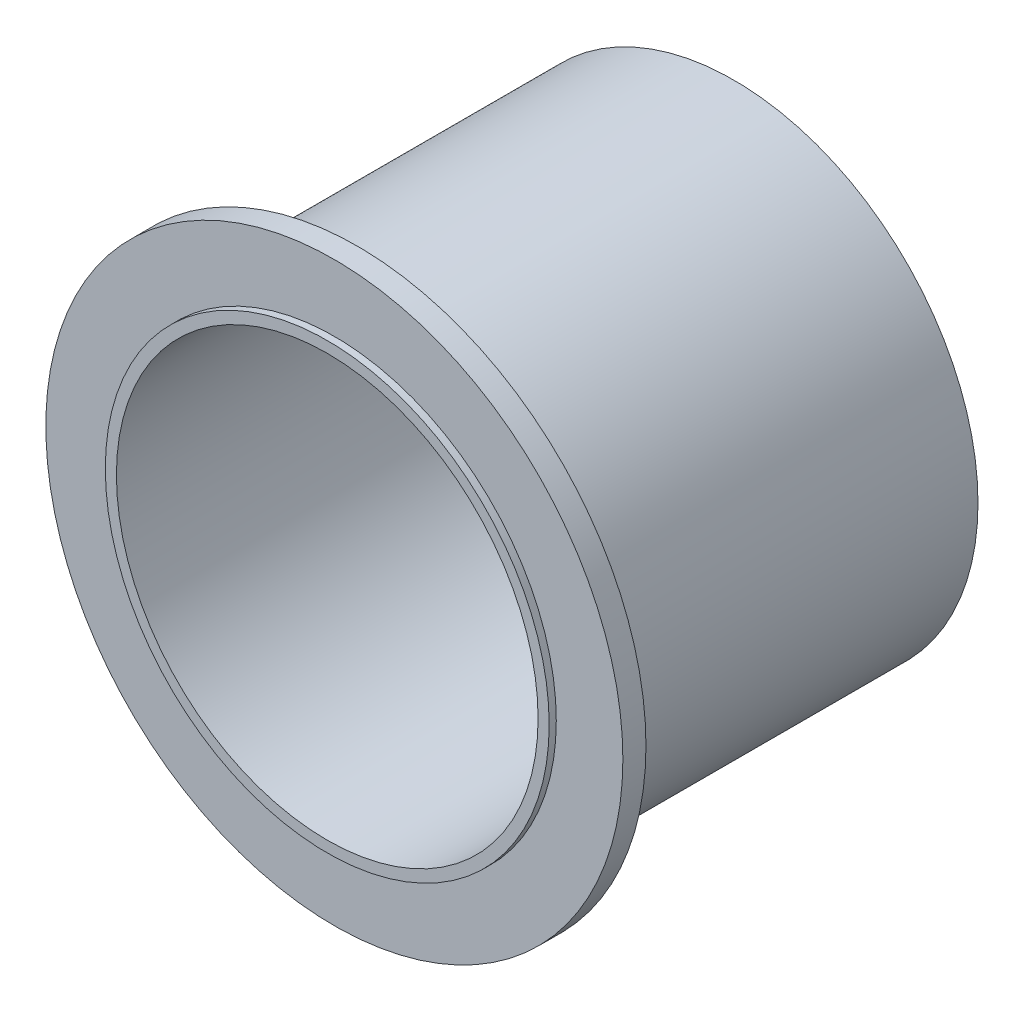
ISO-10303-21;
HEADER;
FILE_DESCRIPTION(('STEP AP214'),'2;1');
FILE_NAME('part.step','',(''),(''),'','','');
FILE_SCHEMA(('AUTOMOTIVE_DESIGN { 1 0 10303 214 1 1 1 1 }'));
ENDSEC;
DATA;
#1=APPLICATION_CONTEXT('core data for automotive mechanical design processes');
#2=APPLICATION_PROTOCOL_DEFINITION('international standard','automotive_design',2000,#1);
#3=PRODUCT_CONTEXT('',#1,'mechanical');
#4=PRODUCT('Part','Part','',(#3));
#5=PRODUCT_RELATED_PRODUCT_CATEGORY('part','',(#4));
#6=PRODUCT_DEFINITION_FORMATION('','',#4);
#7=PRODUCT_DEFINITION_CONTEXT('part definition',#1,'design');
#8=PRODUCT_DEFINITION('design','',#6,#7);
#9=PRODUCT_DEFINITION_SHAPE('','',#8);
#10=(LENGTH_UNIT() NAMED_UNIT(*) SI_UNIT(.MILLI.,.METRE.));
#11=(NAMED_UNIT(*) PLANE_ANGLE_UNIT() SI_UNIT($,.RADIAN.));
#12=(NAMED_UNIT(*) SI_UNIT($,.STERADIAN.) SOLID_ANGLE_UNIT());
#13=UNCERTAINTY_MEASURE_WITH_UNIT(LENGTH_MEASURE(1.E-05),#10,'distance_accuracy_value','');
#14=(GEOMETRIC_REPRESENTATION_CONTEXT(3) GLOBAL_UNCERTAINTY_ASSIGNED_CONTEXT((#13)) GLOBAL_UNIT_ASSIGNED_CONTEXT((#10,
#11,#12)) REPRESENTATION_CONTEXT('',''));
#15=CARTESIAN_POINT('',(0.,0.,0.));
#16=DIRECTION('',(0.,0.,1.));
#17=DIRECTION('',(1.,0.,0.));
#18=AXIS2_PLACEMENT_3D('',#15,#16,#17);
#19=CARTESIAN_POINT('',(0.,0.,0.));
#20=DIRECTION('',(0.,0.,1.));
#21=DIRECTION('',(1.,0.,0.));
#22=AXIS2_PLACEMENT_3D('',#19,#20,#21);
#23=PLANE('',#22);
#24=CARTESIAN_POINT('',(0.,0.,0.));
#25=DIRECTION('',(0.,0.,1.));
#26=DIRECTION('',(1.,0.,0.));
#27=AXIS2_PLACEMENT_3D('',#24,#25,#26);
#28=CIRCLE('',#27,35.9957091385299);
#29=CARTESIAN_POINT('',(35.9957091385299,0.,0.));
#30=VERTEX_POINT('',#29);
#31=EDGE_CURVE('E43',#30,#30,#28,.F.);
#32=ORIENTED_EDGE('',*,*,#31,.T.);
#33=EDGE_LOOP('',(#32));
#34=FACE_BOUND('',#33,.T.);
#35=CARTESIAN_POINT('',(0.,0.,0.));
#36=DIRECTION('',(0.,0.,1.));
#37=DIRECTION('',(1.,0.,0.));
#38=AXIS2_PLACEMENT_3D('',#35,#36,#37);
#39=CIRCLE('',#38,35.687);
#40=CARTESIAN_POINT('',(35.687,0.,0.));
#41=VERTEX_POINT('',#40);
#42=EDGE_CURVE('E52',#41,#41,#39,.T.);
#43=ORIENTED_EDGE('',*,*,#42,.T.);
#44=EDGE_LOOP('',(#43));
#45=FACE_BOUND('',#44,.T.);
#46=ADVANCED_FACE('F32',(#34,#45),#23,.F.);
#47=CARTESIAN_POINT('',(0.,0.,6.35));
#48=DIRECTION('',(0.,0.,1.));
#49=DIRECTION('',(1.,0.,0.));
#50=AXIS2_PLACEMENT_3D('',#47,#48,#49);
#51=PLANE('',#50);
#52=CARTESIAN_POINT('',(0.,0.,6.35));
#53=DIRECTION('',(0.,0.,1.));
#54=DIRECTION('',(1.,0.,0.));
#55=AXIS2_PLACEMENT_3D('',#52,#53,#54);
#56=CIRCLE('',#55,41.275);
#57=CARTESIAN_POINT('',(41.275,0.,6.35));
#58=VERTEX_POINT('',#57);
#59=EDGE_CURVE('E58',#58,#58,#56,.T.);
#60=ORIENTED_EDGE('',*,*,#59,.T.);
#61=EDGE_LOOP('',(#60));
#62=FACE_BOUND('',#61,.T.);
#63=CARTESIAN_POINT('',(0.,0.,6.35));
#64=DIRECTION('',(0.,0.,1.));
#65=DIRECTION('',(1.,0.,0.));
#66=AXIS2_PLACEMENT_3D('',#63,#64,#65);
#67=CIRCLE('',#66,31.75);
#68=CARTESIAN_POINT('',(31.75,0.,6.35));
#69=VERTEX_POINT('',#68);
#70=EDGE_CURVE('E64',#69,#69,#67,.T.);
#71=ORIENTED_EDGE('',*,*,#70,.F.);
#72=EDGE_LOOP('',(#71));
#73=FACE_BOUND('',#72,.T.);
#74=ADVANCED_FACE('F89',(#62,#73),#51,.T.);
#75=CARTESIAN_POINT('',(0.,0.,6.35));
#76=DIRECTION('',(0.,0.,-1.));
#77=DIRECTION('',(-1.,0.,0.));
#78=AXIS2_PLACEMENT_3D('',#75,#76,#77);
#79=CYLINDRICAL_SURFACE('',#78,41.275);
#80=CARTESIAN_POINT('',(0.,0.,3.04800000000004));
#81=DIRECTION('',(0.,0.,1.));
#82=DIRECTION('',(1.,0.,0.));
#83=AXIS2_PLACEMENT_3D('',#80,#81,#82);
#84=CIRCLE('',#83,41.275);
#85=CARTESIAN_POINT('',(41.275,0.,3.04800000000004));
#86=VERTEX_POINT('',#85);
#87=EDGE_CURVE('E47',#86,#86,#84,.T.);
#88=ORIENTED_EDGE('',*,*,#87,.T.);
#89=EDGE_LOOP('',(#88));
#90=FACE_BOUND('',#89,.T.);
#91=ORIENTED_EDGE('',*,*,#59,.F.);
#92=EDGE_LOOP('',(#91));
#93=FACE_BOUND('',#92,.T.);
#94=ADVANCED_FACE('F34',(#90,#93),#79,.T.);
#95=CARTESIAN_POINT('',(0.,0.,7.366));
#96=DIRECTION('',(0.,0.,-1.));
#97=DIRECTION('',(-1.,0.,0.));
#98=AXIS2_PLACEMENT_3D('',#95,#96,#97);
#99=CYLINDRICAL_SURFACE('',#98,31.75);
#100=CARTESIAN_POINT('',(0.,0.,7.366));
#101=DIRECTION('',(0.,0.,1.));
#102=DIRECTION('',(1.,0.,0.));
#103=AXIS2_PLACEMENT_3D('',#100,#101,#102);
#104=CIRCLE('',#103,31.75);
#105=CARTESIAN_POINT('',(31.75,0.,7.366));
#106=VERTEX_POINT('',#105);
#107=EDGE_CURVE('E61',#106,#106,#104,.T.);
#108=ORIENTED_EDGE('',*,*,#107,.F.);
#109=EDGE_LOOP('',(#108));
#110=FACE_BOUND('',#109,.T.);
#111=ORIENTED_EDGE('',*,*,#70,.T.);
#112=EDGE_LOOP('',(#111));
#113=FACE_BOUND('',#112,.T.);
#114=ADVANCED_FACE('F80',(#110,#113),#99,.T.);
#115=CARTESIAN_POINT('',(0.,0.,7.366));
#116=DIRECTION('',(0.,0.,1.));
#117=DIRECTION('',(1.,0.,0.));
#118=AXIS2_PLACEMENT_3D('',#115,#116,#117);
#119=PLANE('',#118);
#120=CARTESIAN_POINT('',(0.,0.,7.366));
#121=DIRECTION('',(0.,0.,1.));
#122=DIRECTION('',(1.,0.,0.));
#123=AXIS2_PLACEMENT_3D('',#120,#121,#122);
#124=CIRCLE('',#123,30.1625);
#125=CARTESIAN_POINT('',(30.1625,0.,7.366));
#126=VERTEX_POINT('',#125);
#127=EDGE_CURVE('E70',#126,#126,#124,.T.);
#128=ORIENTED_EDGE('',*,*,#127,.F.);
#129=EDGE_LOOP('',(#128));
#130=FACE_BOUND('',#129,.T.);
#131=ORIENTED_EDGE('',*,*,#107,.T.);
#132=EDGE_LOOP('',(#131));
#133=FACE_BOUND('',#132,.T.);
#134=ADVANCED_FACE('F76',(#130,#133),#119,.T.);
#135=CARTESIAN_POINT('',(0.,0.,-50.8));
#136=DIRECTION('',(0.,0.,1.));
#137=DIRECTION('',(1.,0.,0.));
#138=AXIS2_PLACEMENT_3D('',#135,#136,#137);
#139=CYLINDRICAL_SURFACE('',#138,34.925);
#140=CARTESIAN_POINT('',(0.,0.,-0.762000000000013));
#141=DIRECTION('',(0.,0.,1.));
#142=DIRECTION('',(1.,0.,0.));
#143=AXIS2_PLACEMENT_3D('',#140,#141,#142);
#144=CIRCLE('',#143,34.925);
#145=CARTESIAN_POINT('',(34.925,0.,-0.762000000000013));
#146=VERTEX_POINT('',#145);
#147=EDGE_CURVE('E55',#146,#146,#144,.F.);
#148=ORIENTED_EDGE('',*,*,#147,.T.);
#149=EDGE_LOOP('',(#148));
#150=FACE_BOUND('',#149,.T.);
#151=CARTESIAN_POINT('',(0.,0.,-50.8));
#152=DIRECTION('',(0.,0.,-1.));
#153=DIRECTION('',(-1.,0.,0.));
#154=AXIS2_PLACEMENT_3D('',#151,#152,#153);
#155=CIRCLE('',#154,34.925);
#156=CARTESIAN_POINT('',(-34.925,0.,-50.8));
#157=VERTEX_POINT('',#156);
#158=EDGE_CURVE('E67',#157,#157,#155,.T.);
#159=ORIENTED_EDGE('',*,*,#158,.F.);
#160=EDGE_LOOP('',(#159));
#161=FACE_BOUND('',#160,.T.);
#162=ADVANCED_FACE('F79',(#150,#161),#139,.T.);
#163=CARTESIAN_POINT('',(0.,0.,-50.8));
#164=DIRECTION('',(0.,0.,-1.));
#165=DIRECTION('',(-1.,0.,0.));
#166=AXIS2_PLACEMENT_3D('',#163,#164,#165);
#167=PLANE('',#166);
#168=CARTESIAN_POINT('',(0.,0.,-50.8));
#169=DIRECTION('',(0.,0.,-1.));
#170=DIRECTION('',(-1.,0.,0.));
#171=AXIS2_PLACEMENT_3D('',#168,#169,#170);
#172=CIRCLE('',#171,33.3375);
#173=CARTESIAN_POINT('',(-33.3375,0.,-50.8));
#174=VERTEX_POINT('',#173);
#175=EDGE_CURVE('E39',#174,#174,#172,.F.);
#176=ORIENTED_EDGE('',*,*,#175,.T.);
#177=EDGE_LOOP('',(#176));
#178=FACE_BOUND('',#177,.T.);
#179=ORIENTED_EDGE('',*,*,#158,.T.);
#180=EDGE_LOOP('',(#179));
#181=FACE_BOUND('',#180,.T.);
#182=ADVANCED_FACE('F102',(#178,#181),#167,.T.);
#183=CARTESIAN_POINT('',(0.,0.,-0.762000000000013));
#184=DIRECTION('',(0.,0.,1.));
#185=DIRECTION('',(1.,0.,0.));
#186=AXIS2_PLACEMENT_3D('',#183,#184,#185);
#187=CONICAL_SURFACE('',#186,34.925,0.785398163397444);
#188=CARTESIAN_POINT('',(35.687,0.,0.));
#189=CARTESIAN_POINT('',(35.6790625,0.,-0.00793750000000187));
#190=CARTESIAN_POINT('',(35.671125,0.,-0.0158750000000015));
#191=CARTESIAN_POINT('',(35.65525,0.,-0.0317500000000007));
#192=CARTESIAN_POINT('',(35.6473125,0.,-0.0396875000000003));
#193=CARTESIAN_POINT('',(35.6314375,0.,-0.0555625000000004));
#194=CARTESIAN_POINT('',(35.6235,0.,-0.0635000000000008));
#195=CARTESIAN_POINT('',(35.607625,0.,-0.0793750000000018));
#196=CARTESIAN_POINT('',(35.5996875,0.,-0.0873125000000023));
#197=CARTESIAN_POINT('',(35.5838125,0.,-0.103187500000002));
#198=CARTESIAN_POINT('',(35.575875,0.,-0.111125000000002));
#199=CARTESIAN_POINT('',(35.56,0.,-0.127000000000001));
#200=CARTESIAN_POINT('',(35.5520625,0.,-0.134937500000002));
#201=CARTESIAN_POINT('',(35.5361875,0.,-0.150812500000003));
#202=CARTESIAN_POINT('',(35.52825,0.,-0.158750000000003));
#203=CARTESIAN_POINT('',(35.512375,0.,-0.174625000000003));
#204=CARTESIAN_POINT('',(35.5044375,0.,-0.182562500000003));
#205=CARTESIAN_POINT('',(35.4885625,0.,-0.198437500000003));
#206=CARTESIAN_POINT('',(35.480625,0.,-0.206375000000003));
#207=CARTESIAN_POINT('',(35.46475,0.,-0.222250000000004));
#208=CARTESIAN_POINT('',(35.4568125,0.,-0.230187500000005));
#209=CARTESIAN_POINT('',(35.4409375,0.,-0.246062500000005));
#210=CARTESIAN_POINT('',(35.433,0.,-0.254000000000004));
#211=CARTESIAN_POINT('',(35.417125,0.,-0.269875000000004));
#212=CARTESIAN_POINT('',(35.4091875,0.,-0.277812500000004));
#213=CARTESIAN_POINT('',(35.3933125,0.,-0.293687500000005));
#214=CARTESIAN_POINT('',(35.385375,0.,-0.301625000000006));
#215=CARTESIAN_POINT('',(35.3695,0.,-0.317500000000006));
#216=CARTESIAN_POINT('',(35.3615625,0.,-0.325437500000005));
#217=CARTESIAN_POINT('',(35.3456875,0.,-0.341312500000005));
#218=CARTESIAN_POINT('',(35.33775,0.,-0.349250000000006));
#219=CARTESIAN_POINT('',(35.321875,0.,-0.365125000000007));
#220=CARTESIAN_POINT('',(35.3139375,0.,-0.373062500000006));
#221=CARTESIAN_POINT('',(35.2980625,0.,-0.388937500000006));
#222=CARTESIAN_POINT('',(35.290125,0.,-0.396875000000006));
#223=CARTESIAN_POINT('',(35.27425,0.,-0.412750000000007));
#224=CARTESIAN_POINT('',(35.2663125,0.,-0.420687500000008));
#225=CARTESIAN_POINT('',(35.2504375,0.,-0.436562500000008));
#226=CARTESIAN_POINT('',(35.2425,0.,-0.444500000000007));
#227=CARTESIAN_POINT('',(35.226625,0.,-0.460375000000007));
#228=CARTESIAN_POINT('',(35.2186875,0.,-0.468312500000008));
#229=CARTESIAN_POINT('',(35.2028125,0.,-0.484187500000009));
#230=CARTESIAN_POINT('',(35.194875,0.,-0.492125000000009));
#231=CARTESIAN_POINT('',(35.179,0.,-0.508000000000009));
#232=CARTESIAN_POINT('',(35.1710625,0.,-0.515937500000008));
#233=CARTESIAN_POINT('',(35.1551875,0.,-0.531812500000008));
#234=CARTESIAN_POINT('',(35.14725,0.,-0.539750000000009));
#235=CARTESIAN_POINT('',(35.131375,0.,-0.55562500000001));
#236=CARTESIAN_POINT('',(35.1234375,0.,-0.56356250000001));
#237=CARTESIAN_POINT('',(35.1075625,0.,-0.57943750000001));
#238=CARTESIAN_POINT('',(35.099625,0.,-0.587375000000009));
#239=CARTESIAN_POINT('',(35.08375,0.,-0.603250000000009));
#240=CARTESIAN_POINT('',(35.0758125,0.,-0.61118750000001));
#241=CARTESIAN_POINT('',(35.0599375,0.,-0.627062500000011));
#242=CARTESIAN_POINT('',(35.052,0.,-0.635000000000011));
#243=CARTESIAN_POINT('',(35.036125,0.,-0.650875000000011));
#244=CARTESIAN_POINT('',(35.0281875,0.,-0.658812500000011));
#245=CARTESIAN_POINT('',(35.0123125,0.,-0.674687500000011));
#246=CARTESIAN_POINT('',(35.004375,0.,-0.682625000000011));
#247=CARTESIAN_POINT('',(34.9885,0.,-0.698500000000012));
#248=CARTESIAN_POINT('',(34.9805625,0.,-0.706437500000012));
#249=CARTESIAN_POINT('',(34.9646875,0.,-0.722312500000013));
#250=CARTESIAN_POINT('',(34.95675,0.,-0.730250000000012));
#251=CARTESIAN_POINT('',(34.940875,0.,-0.746125000000011));
#252=CARTESIAN_POINT('',(34.9329375,0.,-0.754062500000011));
#253=CARTESIAN_POINT('',(34.925,0.,-0.762000000000013));
#254=B_SPLINE_CURVE_WITH_KNOTS('',3,(#188,#189,#190,#191,#192,#193,#194,#195,#196,#197,#198,
#199,#200,#201,#202,#203,#204,#205,#206,#207,#208,#209,#210,#211,#212,#213,#214,#215,#216,#217,
#218,#219,#220,#221,#222,#223,#224,#225,#226,#227,#228,#229,#230,#231,#232,#233,#234,#235,#236,
#237,#238,#239,#240,#241,#242,#243,#244,#245,#246,#247,#248,#249,#250,#251,#252,#253),
.UNSPECIFIED.,.F.,.F.,(4,2,2,2,2,2,2,2,2,2,2,2,2,2,2,2,2,2,2,2,2,2,2,2,2,2,2,2,2,2,2,2,4),(0.,
0.033675960454008,0.067351920908021,0.101027881362029,0.134703841816037,0.16837980227005,
0.202055762724058,0.235731723178066,0.269407683632079,0.303083644086087,0.336759604540095,
0.370435564994108,0.404111525448116,0.437787485902124,0.471463446356137,0.505139406810145,
0.538815367264158,0.572491327718166,0.606167288172174,0.639843248626187,0.673519209080195,
0.707195169534203,0.740871129988216,0.774547090442224,0.808223050896232,0.841899011350245,
0.875574971804253,0.909250932258261,0.942926892712274,0.976602853166282,1.01027881362029,
1.0439547740743,1.07763073452831),.UNSPECIFIED.);
#255=EDGE_CURVE('BSEAM106',#41,#146,#254,.T.);
#256=ORIENTED_EDGE('',*,*,#42,.F.);
#257=ORIENTED_EDGE('',*,*,#147,.F.);
#258=ORIENTED_EDGE('',*,*,#255,.T.);
#259=ORIENTED_EDGE('',*,*,#255,.F.);
#260=EDGE_LOOP('',(#256,#258,#257,#259));
#261=FACE_BOUND('',#260,.T.);
#262=ADVANCED_FACE('F106',(#261),#187,.T.);
#263=CARTESIAN_POINT('',(0.,0.,3.04800000000004));
#264=DIRECTION('',(0.,0.,1.));
#265=DIRECTION('',(1.,0.,0.));
#266=AXIS2_PLACEMENT_3D('',#263,#264,#265);
#267=CONICAL_SURFACE('',#266,41.275,1.0471975511966);
#268=ORIENTED_EDGE('',*,*,#31,.F.);
#269=EDGE_LOOP('',(#268));
#270=FACE_BOUND('',#269,.T.);
#271=ORIENTED_EDGE('',*,*,#87,.F.);
#272=EDGE_LOOP('',(#271));
#273=FACE_BOUND('',#272,.T.);
#274=ADVANCED_FACE('F109',(#270,#273),#267,.T.);
#275=CARTESIAN_POINT('',(0.,0.,-50.8));
#276=DIRECTION('',(0.,0.,1.));
#277=DIRECTION('',(1.,0.,0.));
#278=AXIS2_PLACEMENT_3D('',#275,#276,#277);
#279=CYLINDRICAL_SURFACE('',#278,30.1625);
#280=CARTESIAN_POINT('',(0.,0.,-47.625));
#281=DIRECTION('',(0.,0.,-1.));
#282=DIRECTION('',(-1.,0.,0.));
#283=AXIS2_PLACEMENT_3D('',#280,#281,#282);
#284=CIRCLE('',#283,30.1625);
#285=CARTESIAN_POINT('',(-30.1625,0.,-47.625));
#286=VERTEX_POINT('',#285);
#287=EDGE_CURVE('E10',#286,#286,#284,.T.);
#288=ORIENTED_EDGE('',*,*,#287,.T.);
#289=EDGE_LOOP('',(#288));
#290=FACE_BOUND('',#289,.T.);
#291=ORIENTED_EDGE('',*,*,#127,.T.);
#292=EDGE_LOOP('',(#291));
#293=FACE_BOUND('',#292,.T.);
#294=ADVANCED_FACE('F74',(#290,#293),#279,.F.);
#295=CARTESIAN_POINT('',(0.,0.,-47.625));
#296=DIRECTION('',(0.,0.,-1.));
#297=DIRECTION('',(-1.,0.,0.));
#298=AXIS2_PLACEMENT_3D('',#295,#296,#297);
#299=TOROIDAL_SURFACE('',#298,33.3375,3.175);
#300=ORIENTED_EDGE('',*,*,#287,.F.);
#301=EDGE_LOOP('',(#300));
#302=FACE_BOUND('',#301,.T.);
#303=ORIENTED_EDGE('',*,*,#175,.F.);
#304=EDGE_LOOP('',(#303));
#305=FACE_BOUND('',#304,.T.);
#306=ADVANCED_FACE('F116',(#302,#305),#299,.T.);
#307=CLOSED_SHELL('',(#46,#74,#94,#114,#134,#162,#182,#262,#274,#294,#306));
#308=MANIFOLD_SOLID_BREP('B2',#307);
#309=ADVANCED_BREP_SHAPE_REPRESENTATION('',(#18,#308),#14);
#310=SHAPE_DEFINITION_REPRESENTATION(#9,#309);
ENDSEC;
END-ISO-10303-21;
